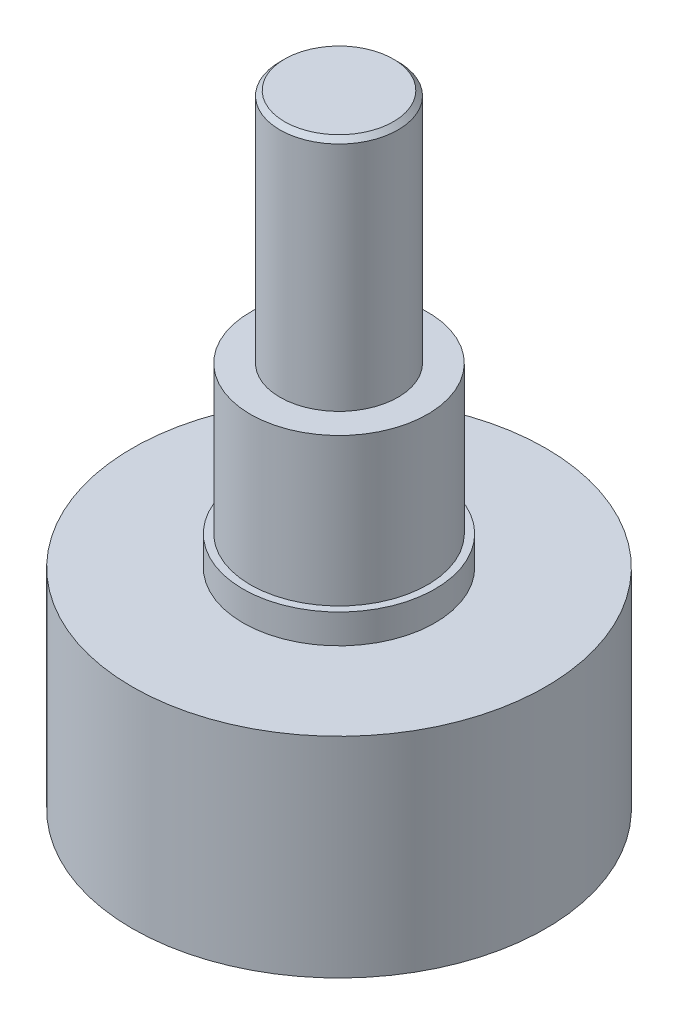
ISO-10303-21;
HEADER;
FILE_DESCRIPTION(('STEP AP214'),'2;1');
FILE_NAME('part.step','',(''),(''),'','','');
FILE_SCHEMA(('AUTOMOTIVE_DESIGN { 1 0 10303 214 1 1 1 1 }'));
ENDSEC;
DATA;
#1=APPLICATION_CONTEXT('core data for automotive mechanical design processes');
#2=APPLICATION_PROTOCOL_DEFINITION('international standard','automotive_design',2000,#1);
#3=PRODUCT_CONTEXT('',#1,'mechanical');
#4=PRODUCT('Part','Part','',(#3));
#5=PRODUCT_RELATED_PRODUCT_CATEGORY('part','',(#4));
#6=PRODUCT_DEFINITION_FORMATION('','',#4);
#7=PRODUCT_DEFINITION_CONTEXT('part definition',#1,'design');
#8=PRODUCT_DEFINITION('design','',#6,#7);
#9=PRODUCT_DEFINITION_SHAPE('','',#8);
#10=(LENGTH_UNIT() NAMED_UNIT(*) SI_UNIT(.MILLI.,.METRE.));
#11=(NAMED_UNIT(*) PLANE_ANGLE_UNIT() SI_UNIT($,.RADIAN.));
#12=(NAMED_UNIT(*) SI_UNIT($,.STERADIAN.) SOLID_ANGLE_UNIT());
#13=UNCERTAINTY_MEASURE_WITH_UNIT(LENGTH_MEASURE(1.E-05),#10,'distance_accuracy_value','');
#14=(GEOMETRIC_REPRESENTATION_CONTEXT(3) GLOBAL_UNCERTAINTY_ASSIGNED_CONTEXT((#13)) GLOBAL_UNIT_ASSIGNED_CONTEXT((#10,
#11,#12)) REPRESENTATION_CONTEXT('',''));
#15=CARTESIAN_POINT('',(0.,0.,0.));
#16=DIRECTION('',(0.,0.,1.));
#17=DIRECTION('',(1.,0.,0.));
#18=AXIS2_PLACEMENT_3D('',#15,#16,#17);
#19=CARTESIAN_POINT('',(0.,11.2522,0.));
#20=DIRECTION('',(0.,-1.,0.));
#21=DIRECTION('',(0.,0.,-1.));
#22=AXIS2_PLACEMENT_3D('',#19,#20,#21);
#23=CYLINDRICAL_SURFACE('',#22,11.1125);
#24=CARTESIAN_POINT('',(0.,11.2522,0.));
#25=DIRECTION('',(0.,1.,0.));
#26=DIRECTION('',(0.,0.,1.));
#27=AXIS2_PLACEMENT_3D('',#24,#25,#26);
#28=CIRCLE('',#27,11.1125);
#29=CARTESIAN_POINT('',(0.,11.2522,11.1125));
#30=VERTEX_POINT('',#29);
#31=EDGE_CURVE('E44',#30,#30,#28,.T.);
#32=ORIENTED_EDGE('',*,*,#31,.F.);
#33=EDGE_LOOP('',(#32));
#34=FACE_BOUND('',#33,.T.);
#35=CARTESIAN_POINT('',(0.,0.,0.));
#36=DIRECTION('',(0.,1.,0.));
#37=DIRECTION('',(0.,0.,1.));
#38=AXIS2_PLACEMENT_3D('',#35,#36,#37);
#39=CIRCLE('',#38,11.1125);
#40=CARTESIAN_POINT('',(0.,0.,11.1125));
#41=VERTEX_POINT('',#40);
#42=EDGE_CURVE('E48',#41,#41,#39,.T.);
#43=ORIENTED_EDGE('',*,*,#42,.T.);
#44=EDGE_LOOP('',(#43));
#45=FACE_BOUND('',#44,.T.);
#46=ADVANCED_FACE('F33',(#34,#45),#23,.T.);
#47=CARTESIAN_POINT('',(0.,11.2522,0.));
#48=DIRECTION('',(0.,1.,0.));
#49=DIRECTION('',(0.,0.,1.));
#50=AXIS2_PLACEMENT_3D('',#47,#48,#49);
#51=PLANE('',#50);
#52=CARTESIAN_POINT('',(0.,11.2522,0.));
#53=DIRECTION('',(0.,1.,0.));
#54=DIRECTION('',(0.,0.,1.));
#55=AXIS2_PLACEMENT_3D('',#52,#53,#54);
#56=CIRCLE('',#55,5.15874);
#57=CARTESIAN_POINT('',(0.,11.2522,5.15874));
#58=VERTEX_POINT('',#57);
#59=EDGE_CURVE('E54',#58,#58,#56,.T.);
#60=ORIENTED_EDGE('',*,*,#59,.F.);
#61=EDGE_LOOP('',(#60));
#62=FACE_BOUND('',#61,.T.);
#63=ORIENTED_EDGE('',*,*,#31,.T.);
#64=EDGE_LOOP('',(#63));
#65=FACE_BOUND('',#64,.T.);
#66=ADVANCED_FACE('F96',(#62,#65),#51,.T.);
#67=CARTESIAN_POINT('',(0.,0.,0.));
#68=DIRECTION('',(0.,1.,0.));
#69=DIRECTION('',(0.,0.,1.));
#70=AXIS2_PLACEMENT_3D('',#67,#68,#69);
#71=PLANE('',#70);
#72=ORIENTED_EDGE('',*,*,#42,.F.);
#73=EDGE_LOOP('',(#72));
#74=FACE_BOUND('',#73,.T.);
#75=ADVANCED_FACE('F92',(#74),#71,.F.);
#76=CARTESIAN_POINT('',(0.,12.827,0.));
#77=DIRECTION('',(0.,-1.,0.));
#78=DIRECTION('',(0.,0.,-1.));
#79=AXIS2_PLACEMENT_3D('',#76,#77,#78);
#80=CYLINDRICAL_SURFACE('',#79,5.15874);
#81=CARTESIAN_POINT('',(0.,12.827,0.));
#82=DIRECTION('',(0.,1.,0.));
#83=DIRECTION('',(0.,0.,1.));
#84=AXIS2_PLACEMENT_3D('',#81,#82,#83);
#85=CIRCLE('',#84,5.15874);
#86=CARTESIAN_POINT('',(0.,12.827,5.15874));
#87=VERTEX_POINT('',#86);
#88=EDGE_CURVE('E52',#87,#87,#85,.T.);
#89=ORIENTED_EDGE('',*,*,#88,.F.);
#90=EDGE_LOOP('',(#89));
#91=FACE_BOUND('',#90,.T.);
#92=ORIENTED_EDGE('',*,*,#59,.T.);
#93=EDGE_LOOP('',(#92));
#94=FACE_BOUND('',#93,.T.);
#95=ADVANCED_FACE('F86',(#91,#94),#80,.T.);
#96=CARTESIAN_POINT('',(0.,12.827,0.));
#97=DIRECTION('',(0.,1.,0.));
#98=DIRECTION('',(0.,0.,1.));
#99=AXIS2_PLACEMENT_3D('',#96,#97,#98);
#100=PLANE('',#99);
#101=CARTESIAN_POINT('',(0.,12.827,0.));
#102=DIRECTION('',(0.,1.,0.));
#103=DIRECTION('',(0.,0.,1.));
#104=AXIS2_PLACEMENT_3D('',#101,#102,#103);
#105=CIRCLE('',#104,4.7625);
#106=CARTESIAN_POINT('',(0.,12.827,4.7625));
#107=VERTEX_POINT('',#106);
#108=EDGE_CURVE('E60',#107,#107,#105,.T.);
#109=ORIENTED_EDGE('',*,*,#108,.F.);
#110=EDGE_LOOP('',(#109));
#111=FACE_BOUND('',#110,.T.);
#112=ORIENTED_EDGE('',*,*,#88,.T.);
#113=EDGE_LOOP('',(#112));
#114=FACE_BOUND('',#113,.T.);
#115=ADVANCED_FACE('F80',(#111,#114),#100,.T.);
#116=CARTESIAN_POINT('',(0.,20.7645,0.));
#117=DIRECTION('',(0.,-1.,0.));
#118=DIRECTION('',(0.,0.,-1.));
#119=AXIS2_PLACEMENT_3D('',#116,#117,#118);
#120=CYLINDRICAL_SURFACE('',#119,4.7625);
#121=CARTESIAN_POINT('',(0.,20.7645,0.));
#122=DIRECTION('',(0.,1.,0.));
#123=DIRECTION('',(0.,0.,1.));
#124=AXIS2_PLACEMENT_3D('',#121,#122,#123);
#125=CIRCLE('',#124,4.7625);
#126=CARTESIAN_POINT('',(0.,20.7645,4.7625));
#127=VERTEX_POINT('',#126);
#128=EDGE_CURVE('E57',#127,#127,#125,.T.);
#129=ORIENTED_EDGE('',*,*,#128,.F.);
#130=EDGE_LOOP('',(#129));
#131=FACE_BOUND('',#130,.T.);
#132=ORIENTED_EDGE('',*,*,#108,.T.);
#133=EDGE_LOOP('',(#132));
#134=FACE_BOUND('',#133,.T.);
#135=ADVANCED_FACE('F74',(#131,#134),#120,.T.);
#136=CARTESIAN_POINT('',(0.,20.7645,0.));
#137=DIRECTION('',(0.,1.,0.));
#138=DIRECTION('',(0.,0.,1.));
#139=AXIS2_PLACEMENT_3D('',#136,#137,#138);
#140=PLANE('',#139);
#141=CARTESIAN_POINT('',(0.,20.7645,0.));
#142=DIRECTION('',(0.,1.,0.));
#143=DIRECTION('',(0.,0.,1.));
#144=AXIS2_PLACEMENT_3D('',#141,#142,#143);
#145=CIRCLE('',#144,3.175);
#146=CARTESIAN_POINT('',(0.,20.7645,3.175));
#147=VERTEX_POINT('',#146);
#148=EDGE_CURVE('E63',#147,#147,#145,.T.);
#149=ORIENTED_EDGE('',*,*,#148,.F.);
#150=EDGE_LOOP('',(#149));
#151=FACE_BOUND('',#150,.T.);
#152=ORIENTED_EDGE('',*,*,#128,.T.);
#153=EDGE_LOOP('',(#152));
#154=FACE_BOUND('',#153,.T.);
#155=ADVANCED_FACE('F71',(#151,#154),#140,.T.);
#156=CARTESIAN_POINT('',(0.,33.4645,0.));
#157=DIRECTION('',(0.,-1.,0.));
#158=DIRECTION('',(0.,0.,-1.));
#159=AXIS2_PLACEMENT_3D('',#156,#157,#158);
#160=CYLINDRICAL_SURFACE('',#159,3.175);
#161=CARTESIAN_POINT('',(0.,33.2105,0.));
#162=DIRECTION('',(0.,1.,0.));
#163=DIRECTION('',(0.,0.,1.));
#164=AXIS2_PLACEMENT_3D('',#161,#162,#163);
#165=CIRCLE('',#164,3.175);
#166=CARTESIAN_POINT('',(0.,33.2105,3.175));
#167=VERTEX_POINT('',#166);
#168=EDGE_CURVE('E10',#167,#167,#165,.F.);
#169=ORIENTED_EDGE('',*,*,#168,.T.);
#170=EDGE_LOOP('',(#169));
#171=FACE_BOUND('',#170,.T.);
#172=ORIENTED_EDGE('',*,*,#148,.T.);
#173=EDGE_LOOP('',(#172));
#174=FACE_BOUND('',#173,.T.);
#175=ADVANCED_FACE('F69',(#171,#174),#160,.T.);
#176=CARTESIAN_POINT('',(0.,33.4645,0.));
#177=DIRECTION('',(0.,1.,0.));
#178=DIRECTION('',(0.,0.,1.));
#179=AXIS2_PLACEMENT_3D('',#176,#177,#178);
#180=PLANE('',#179);
#181=CARTESIAN_POINT('',(0.,33.4645,0.));
#182=DIRECTION('',(0.,1.,0.));
#183=DIRECTION('',(0.,0.,1.));
#184=AXIS2_PLACEMENT_3D('',#181,#182,#183);
#185=CIRCLE('',#184,2.92100000000001);
#186=CARTESIAN_POINT('',(0.,33.4645,2.92100000000001));
#187=VERTEX_POINT('',#186);
#188=EDGE_CURVE('E40',#187,#187,#185,.T.);
#189=ORIENTED_EDGE('',*,*,#188,.T.);
#190=EDGE_LOOP('',(#189));
#191=FACE_BOUND('',#190,.T.);
#192=ADVANCED_FACE('F113',(#191),#180,.T.);
#193=CARTESIAN_POINT('',(0.,33.4645,0.));
#194=DIRECTION('',(0.,-1.,0.));
#195=DIRECTION('',(0.,0.,-1.));
#196=AXIS2_PLACEMENT_3D('',#193,#194,#195);
#197=CONICAL_SURFACE('',#196,2.92100000000001,0.785398163397453);
#198=ORIENTED_EDGE('',*,*,#168,.F.);
#199=EDGE_LOOP('',(#198));
#200=FACE_BOUND('',#199,.T.);
#201=ORIENTED_EDGE('',*,*,#188,.F.);
#202=EDGE_LOOP('',(#201));
#203=FACE_BOUND('',#202,.T.);
#204=ADVANCED_FACE('F35',(#200,#203),#197,.T.);
#205=CLOSED_SHELL('',(#46,#66,#75,#95,#115,#135,#155,#175,#192,#204));
#206=MANIFOLD_SOLID_BREP('B2',#205);
#207=ADVANCED_BREP_SHAPE_REPRESENTATION('',(#18,#206),#14);
#208=SHAPE_DEFINITION_REPRESENTATION(#9,#207);
ENDSEC;
END-ISO-10303-21;
